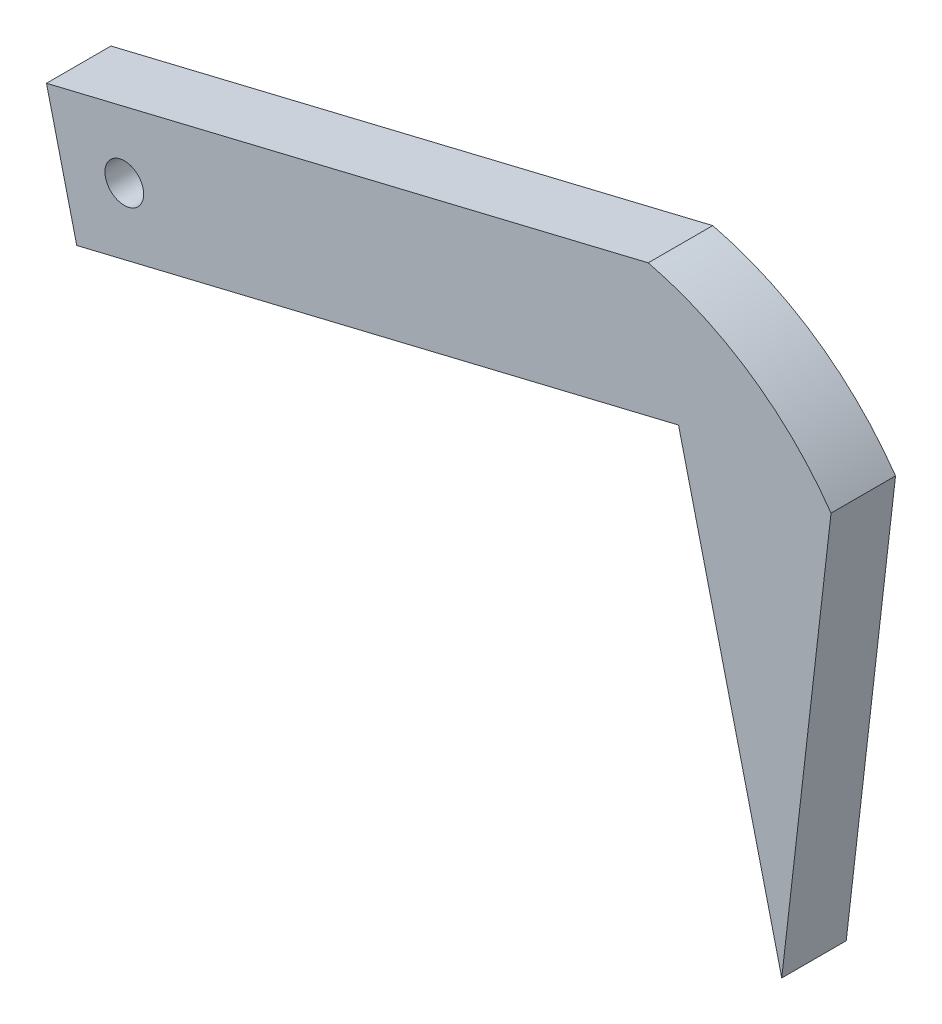
ISO-10303-21;
HEADER;
FILE_DESCRIPTION(('STEP AP214'),'2;1');
FILE_NAME('part.step','',(''),(''),'','','');
FILE_SCHEMA(('AUTOMOTIVE_DESIGN { 1 0 10303 214 1 1 1 1 }'));
ENDSEC;
DATA;
#1=APPLICATION_CONTEXT('core data for automotive mechanical design processes');
#2=APPLICATION_PROTOCOL_DEFINITION('international standard','automotive_design',2000,#1);
#3=PRODUCT_CONTEXT('',#1,'mechanical');
#4=PRODUCT('Part','Part','',(#3));
#5=PRODUCT_RELATED_PRODUCT_CATEGORY('part','',(#4));
#6=PRODUCT_DEFINITION_FORMATION('','',#4);
#7=PRODUCT_DEFINITION_CONTEXT('part definition',#1,'design');
#8=PRODUCT_DEFINITION('design','',#6,#7);
#9=PRODUCT_DEFINITION_SHAPE('','',#8);
#10=(LENGTH_UNIT() NAMED_UNIT(*) SI_UNIT(.MILLI.,.METRE.));
#11=(NAMED_UNIT(*) PLANE_ANGLE_UNIT() SI_UNIT($,.RADIAN.));
#12=(NAMED_UNIT(*) SI_UNIT($,.STERADIAN.) SOLID_ANGLE_UNIT());
#13=UNCERTAINTY_MEASURE_WITH_UNIT(LENGTH_MEASURE(1.E-05),#10,'distance_accuracy_value','');
#14=(GEOMETRIC_REPRESENTATION_CONTEXT(3) GLOBAL_UNCERTAINTY_ASSIGNED_CONTEXT((#13)) GLOBAL_UNIT_ASSIGNED_CONTEXT((#10,
#11,#12)) REPRESENTATION_CONTEXT('',''));
#15=CARTESIAN_POINT('',(0.,0.,0.));
#16=DIRECTION('',(0.,0.,1.));
#17=DIRECTION('',(1.,0.,0.));
#18=AXIS2_PLACEMENT_3D('',#15,#16,#17);
#19=CARTESIAN_POINT('',(40.8932604779357,-12.3264452572122,5.));
#20=DIRECTION('',(0.,0.,-1.));
#21=DIRECTION('',(-1.,0.,0.));
#22=AXIS2_PLACEMENT_3D('',#19,#20,#21);
#23=PLANE('',#22);
#24=DIRECTION('',(-0.972041221603923,-0.234810271288871,0.));
#25=VECTOR('',#24,1.);
#26=CARTESIAN_POINT('',(0.,0.,5.));
#27=LINE('',#26,#25);
#28=CARTESIAN_POINT('',(46.6579786369883,11.2708930218658,5.));
#29=VERTEX_POINT('',#28);
#30=CARTESIAN_POINT('',(0.,0.,5.));
#31=VERTEX_POINT('',#30);
#32=EDGE_CURVE('E129',#29,#31,#27,.T.);
#33=ORIENTED_EDGE('',*,*,#32,.T.);
#34=DIRECTION('',(0.234810271288871,-0.972041221603923,0.));
#35=VECTOR('',#34,1.);
#36=CARTESIAN_POINT('',(2.34810271288871,-9.72041221603924,5.));
#37=LINE('',#36,#35);
#38=CARTESIAN_POINT('',(2.34810271288871,-9.72041221603924,5.));
#39=VERTEX_POINT('',#38);
#40=EDGE_CURVE('E87',#31,#39,#37,.T.);
#41=ORIENTED_EDGE('',*,*,#40,.T.);
#42=DIRECTION('',(0.972041221603923,0.234810271288871,0.));
#43=VECTOR('',#42,1.);
#44=CARTESIAN_POINT('',(49.006081349877,1.55048080582657,5.));
#45=LINE('',#44,#43);
#46=CARTESIAN_POINT('',(49.006081349877,1.55048080582657,5.));
#47=VERTEX_POINT('',#46);
#48=EDGE_CURVE('E100',#39,#47,#45,.T.);
#49=ORIENTED_EDGE('',*,*,#48,.T.);
#50=DIRECTION('',(0.234810271288871,-0.972041221603923,0.));
#51=VECTOR('',#50,1.);
#52=CARTESIAN_POINT('',(49.006081349877,1.55048080582657,5.));
#53=LINE('',#52,#51);
#54=CARTESIAN_POINT('',(57.0081501427766,-31.5755859633718,5.));
#55=VERTEX_POINT('',#54);
#56=EDGE_CURVE('E94',#47,#55,#53,.T.);
#57=ORIENTED_EDGE('',*,*,#56,.T.);
#58=DIRECTION('',(0.114630189509351,0.993408234137935,0.));
#59=VECTOR('',#58,1.);
#60=CARTESIAN_POINT('',(60.8305941098812,1.55048080582657,5.));
#61=LINE('',#60,#59);
#62=CARTESIAN_POINT('',(60.8305941098812,1.55048080582657,5.));
#63=VERTEX_POINT('',#62);
#64=EDGE_CURVE('E98',#55,#63,#61,.T.);
#65=ORIENTED_EDGE('',*,*,#64,.T.);
#66=CARTESIAN_POINT('',(40.8932604779357,-12.3264452572122,5.));
#67=DIRECTION('',(0.,0.,1.));
#68=DIRECTION('',(-1.,0.,0.));
#69=AXIS2_PLACEMENT_3D('',#66,#67,#68);
#70=CIRCLE('',#69,24.2912813435304);
#71=EDGE_CURVE('E50',#63,#29,#70,.T.);
#72=ORIENTED_EDGE('',*,*,#71,.T.);
#73=EDGE_LOOP('',(#33,#41,#49,#57,#65,#72));
#74=FACE_BOUND('',#73,.T.);
#75=CARTESIAN_POINT('',(6.03425746446392,-3.68615475157527,5.));
#76=DIRECTION('',(0.,0.,1.));
#77=DIRECTION('',(1.,0.,0.));
#78=AXIS2_PLACEMENT_3D('',#75,#76,#77);
#79=CIRCLE('',#78,1.5);
#80=CARTESIAN_POINT('',(7.53425746446392,-3.68615475157527,5.));
#81=VERTEX_POINT('',#80);
#82=EDGE_CURVE('E122',#81,#81,#79,.T.);
#83=ORIENTED_EDGE('',*,*,#82,.F.);
#84=EDGE_LOOP('',(#83));
#85=FACE_BOUND('',#84,.T.);
#86=ADVANCED_FACE('F33',(#74,#85),#23,.F.);
#87=CARTESIAN_POINT('',(40.8932604779357,-12.3264452572122,0.));
#88=DIRECTION('',(0.,0.,-1.));
#89=DIRECTION('',(-1.,0.,0.));
#90=AXIS2_PLACEMENT_3D('',#87,#88,#89);
#91=PLANE('',#90);
#92=DIRECTION('',(-0.972041221603923,-0.234810271288871,0.));
#93=VECTOR('',#92,1.);
#94=CARTESIAN_POINT('',(0.,0.,0.));
#95=LINE('',#94,#93);
#96=CARTESIAN_POINT('',(46.6579786369883,11.2708930218658,0.));
#97=VERTEX_POINT('',#96);
#98=CARTESIAN_POINT('',(0.,0.,0.));
#99=VERTEX_POINT('',#98);
#100=EDGE_CURVE('E118',#97,#99,#95,.T.);
#101=ORIENTED_EDGE('',*,*,#100,.F.);
#102=CARTESIAN_POINT('',(40.8932604779357,-12.3264452572122,0.));
#103=DIRECTION('',(0.,0.,1.));
#104=DIRECTION('',(-1.,0.,0.));
#105=AXIS2_PLACEMENT_3D('',#102,#103,#104);
#106=CIRCLE('',#105,24.2912813435304);
#107=CARTESIAN_POINT('',(60.8305941098812,1.55048080582657,0.));
#108=VERTEX_POINT('',#107);
#109=EDGE_CURVE('E79',#108,#97,#106,.T.);
#110=ORIENTED_EDGE('',*,*,#109,.F.);
#111=DIRECTION('',(0.114630189509351,0.993408234137935,0.));
#112=VECTOR('',#111,1.);
#113=CARTESIAN_POINT('',(60.8305941098812,1.55048080582657,0.));
#114=LINE('',#113,#112);
#115=CARTESIAN_POINT('',(57.0081501427766,-31.5755859633718,0.));
#116=VERTEX_POINT('',#115);
#117=EDGE_CURVE('E73',#116,#108,#114,.T.);
#118=ORIENTED_EDGE('',*,*,#117,.F.);
#119=DIRECTION('',(0.234810271288871,-0.972041221603923,0.));
#120=VECTOR('',#119,1.);
#121=CARTESIAN_POINT('',(49.006081349877,1.55048080582657,0.));
#122=LINE('',#121,#120);
#123=CARTESIAN_POINT('',(49.006081349877,1.55048080582657,0.));
#124=VERTEX_POINT('',#123);
#125=EDGE_CURVE('E108',#124,#116,#122,.T.);
#126=ORIENTED_EDGE('',*,*,#125,.F.);
#127=DIRECTION('',(0.972041221603923,0.234810271288871,0.));
#128=VECTOR('',#127,1.);
#129=CARTESIAN_POINT('',(49.006081349877,1.55048080582657,0.));
#130=LINE('',#129,#128);
#131=CARTESIAN_POINT('',(2.34810271288871,-9.72041221603924,0.));
#132=VERTEX_POINT('',#131);
#133=EDGE_CURVE('E124',#132,#124,#130,.T.);
#134=ORIENTED_EDGE('',*,*,#133,.F.);
#135=DIRECTION('',(0.234810271288871,-0.972041221603923,0.));
#136=VECTOR('',#135,1.);
#137=CARTESIAN_POINT('',(2.34810271288871,-9.72041221603924,0.));
#138=LINE('',#137,#136);
#139=EDGE_CURVE('E121',#99,#132,#138,.T.);
#140=ORIENTED_EDGE('',*,*,#139,.F.);
#141=EDGE_LOOP('',(#101,#110,#118,#126,#134,#140));
#142=FACE_BOUND('',#141,.T.);
#143=CARTESIAN_POINT('',(6.03425746446392,-3.68615475157527,0.));
#144=DIRECTION('',(0.,0.,1.));
#145=DIRECTION('',(1.,0.,0.));
#146=AXIS2_PLACEMENT_3D('',#143,#144,#145);
#147=CIRCLE('',#146,1.5);
#148=CARTESIAN_POINT('',(7.53425746446392,-3.68615475157527,0.));
#149=VERTEX_POINT('',#148);
#150=EDGE_CURVE('E222',#149,#149,#147,.T.);
#151=ORIENTED_EDGE('',*,*,#150,.T.);
#152=EDGE_LOOP('',(#151));
#153=FACE_BOUND('',#152,.T.);
#154=ADVANCED_FACE('F138',(#142,#153),#91,.T.);
#155=CARTESIAN_POINT('',(0.,0.,5.));
#156=DIRECTION('',(0.234810271288871,-0.972041221603923,0.));
#157=DIRECTION('',(0.972041221603923,0.234810271288871,0.));
#158=AXIS2_PLACEMENT_3D('',#155,#156,#157);
#159=PLANE('',#158);
#160=ORIENTED_EDGE('',*,*,#100,.T.);
#161=DIRECTION('',(0.,0.,-1.));
#162=VECTOR('',#161,1.);
#163=CARTESIAN_POINT('',(0.,0.,5.));
#164=LINE('',#163,#162);
#165=EDGE_CURVE('E11',#31,#99,#164,.T.);
#166=ORIENTED_EDGE('',*,*,#165,.F.);
#167=ORIENTED_EDGE('',*,*,#32,.F.);
#168=DIRECTION('',(0.,0.,-1.));
#169=VECTOR('',#168,1.);
#170=CARTESIAN_POINT('',(46.6579786369883,11.2708930218658,5.));
#171=LINE('',#170,#169);
#172=EDGE_CURVE('E114',#29,#97,#171,.T.);
#173=ORIENTED_EDGE('',*,*,#172,.T.);
#174=EDGE_LOOP('',(#160,#166,#167,#173));
#175=FACE_BOUND('',#174,.T.);
#176=ADVANCED_FACE('F35',(#175),#159,.F.);
#177=CARTESIAN_POINT('',(2.34810271288871,-9.72041221603924,5.));
#178=DIRECTION('',(0.972041221603923,0.234810271288871,0.));
#179=DIRECTION('',(-0.234810271288871,0.972041221603923,0.));
#180=AXIS2_PLACEMENT_3D('',#177,#178,#179);
#181=PLANE('',#180);
#182=ORIENTED_EDGE('',*,*,#139,.T.);
#183=DIRECTION('',(0.,0.,-1.));
#184=VECTOR('',#183,1.);
#185=CARTESIAN_POINT('',(2.34810271288871,-9.72041221603924,5.));
#186=LINE('',#185,#184);
#187=EDGE_CURVE('E42',#39,#132,#186,.T.);
#188=ORIENTED_EDGE('',*,*,#187,.F.);
#189=ORIENTED_EDGE('',*,*,#40,.F.);
#190=ORIENTED_EDGE('',*,*,#165,.T.);
#191=EDGE_LOOP('',(#182,#188,#189,#190));
#192=FACE_BOUND('',#191,.T.);
#193=ADVANCED_FACE('F163',(#192),#181,.F.);
#194=CARTESIAN_POINT('',(49.006081349877,1.55048080582657,5.));
#195=DIRECTION('',(-0.234810271288871,0.972041221603923,0.));
#196=DIRECTION('',(-0.972041221603923,-0.234810271288871,0.));
#197=AXIS2_PLACEMENT_3D('',#194,#195,#196);
#198=PLANE('',#197);
#199=ORIENTED_EDGE('',*,*,#133,.T.);
#200=DIRECTION('',(0.,0.,-1.));
#201=VECTOR('',#200,1.);
#202=CARTESIAN_POINT('',(49.006081349877,1.55048080582657,5.));
#203=LINE('',#202,#201);
#204=EDGE_CURVE('E109',#47,#124,#203,.T.);
#205=ORIENTED_EDGE('',*,*,#204,.F.);
#206=ORIENTED_EDGE('',*,*,#48,.F.);
#207=ORIENTED_EDGE('',*,*,#187,.T.);
#208=EDGE_LOOP('',(#199,#205,#206,#207));
#209=FACE_BOUND('',#208,.T.);
#210=ADVANCED_FACE('F135',(#209),#198,.F.);
#211=CARTESIAN_POINT('',(49.006081349877,1.55048080582657,5.));
#212=DIRECTION('',(0.972041221603923,0.234810271288871,0.));
#213=DIRECTION('',(-0.234810271288871,0.972041221603923,0.));
#214=AXIS2_PLACEMENT_3D('',#211,#212,#213);
#215=PLANE('',#214);
#216=ORIENTED_EDGE('',*,*,#125,.T.);
#217=DIRECTION('',(0.,0.,-1.));
#218=VECTOR('',#217,1.);
#219=CARTESIAN_POINT('',(57.0081501427766,-31.5755859633718,5.));
#220=LINE('',#219,#218);
#221=EDGE_CURVE('E105',#55,#116,#220,.T.);
#222=ORIENTED_EDGE('',*,*,#221,.F.);
#223=ORIENTED_EDGE('',*,*,#56,.F.);
#224=ORIENTED_EDGE('',*,*,#204,.T.);
#225=EDGE_LOOP('',(#216,#222,#223,#224));
#226=FACE_BOUND('',#225,.T.);
#227=ADVANCED_FACE('F106',(#226),#215,.F.);
#228=CARTESIAN_POINT('',(60.8305941098812,1.55048080582657,5.));
#229=DIRECTION('',(-0.993408234137935,0.114630189509351,0.));
#230=DIRECTION('',(-0.114630189509351,-0.993408234137935,0.));
#231=AXIS2_PLACEMENT_3D('',#228,#229,#230);
#232=PLANE('',#231);
#233=ORIENTED_EDGE('',*,*,#117,.T.);
#234=DIRECTION('',(0.,0.,-1.));
#235=VECTOR('',#234,1.);
#236=CARTESIAN_POINT('',(60.8305941098812,1.55048080582657,5.));
#237=LINE('',#236,#235);
#238=EDGE_CURVE('E110',#63,#108,#237,.T.);
#239=ORIENTED_EDGE('',*,*,#238,.F.);
#240=ORIENTED_EDGE('',*,*,#64,.F.);
#241=ORIENTED_EDGE('',*,*,#221,.T.);
#242=EDGE_LOOP('',(#233,#239,#240,#241));
#243=FACE_BOUND('',#242,.T.);
#244=ADVANCED_FACE('F112',(#243),#232,.F.);
#245=CARTESIAN_POINT('',(40.8932604779357,-12.3264452572122,5.));
#246=DIRECTION('',(0.,0.,-1.));
#247=DIRECTION('',(-1.,0.,0.));
#248=AXIS2_PLACEMENT_3D('',#245,#246,#247);
#249=CYLINDRICAL_SURFACE('',#248,24.2912813435304);
#250=ORIENTED_EDGE('',*,*,#109,.T.);
#251=ORIENTED_EDGE('',*,*,#172,.F.);
#252=ORIENTED_EDGE('',*,*,#71,.F.);
#253=ORIENTED_EDGE('',*,*,#238,.T.);
#254=EDGE_LOOP('',(#250,#251,#252,#253));
#255=FACE_BOUND('',#254,.T.);
#256=ADVANCED_FACE('F143',(#255),#249,.T.);
#257=CARTESIAN_POINT('',(6.03425746446392,-3.68615475157527,5.));
#258=DIRECTION('',(0.,0.,-1.));
#259=DIRECTION('',(-1.,0.,0.));
#260=AXIS2_PLACEMENT_3D('',#257,#258,#259);
#261=CYLINDRICAL_SURFACE('',#260,1.5);
#262=ORIENTED_EDGE('',*,*,#82,.T.);
#263=EDGE_LOOP('',(#262));
#264=FACE_BOUND('',#263,.T.);
#265=ORIENTED_EDGE('',*,*,#150,.F.);
#266=EDGE_LOOP('',(#265));
#267=FACE_BOUND('',#266,.T.);
#268=ADVANCED_FACE('F145',(#264,#267),#261,.F.);
#269=CLOSED_SHELL('',(#86,#154,#176,#193,#210,#227,#244,#256,#268));
#270=MANIFOLD_SOLID_BREP('B2',#269);
#271=ADVANCED_BREP_SHAPE_REPRESENTATION('',(#18,#270),#14);
#272=SHAPE_DEFINITION_REPRESENTATION(#9,#271);
ENDSEC;
END-ISO-10303-21;
